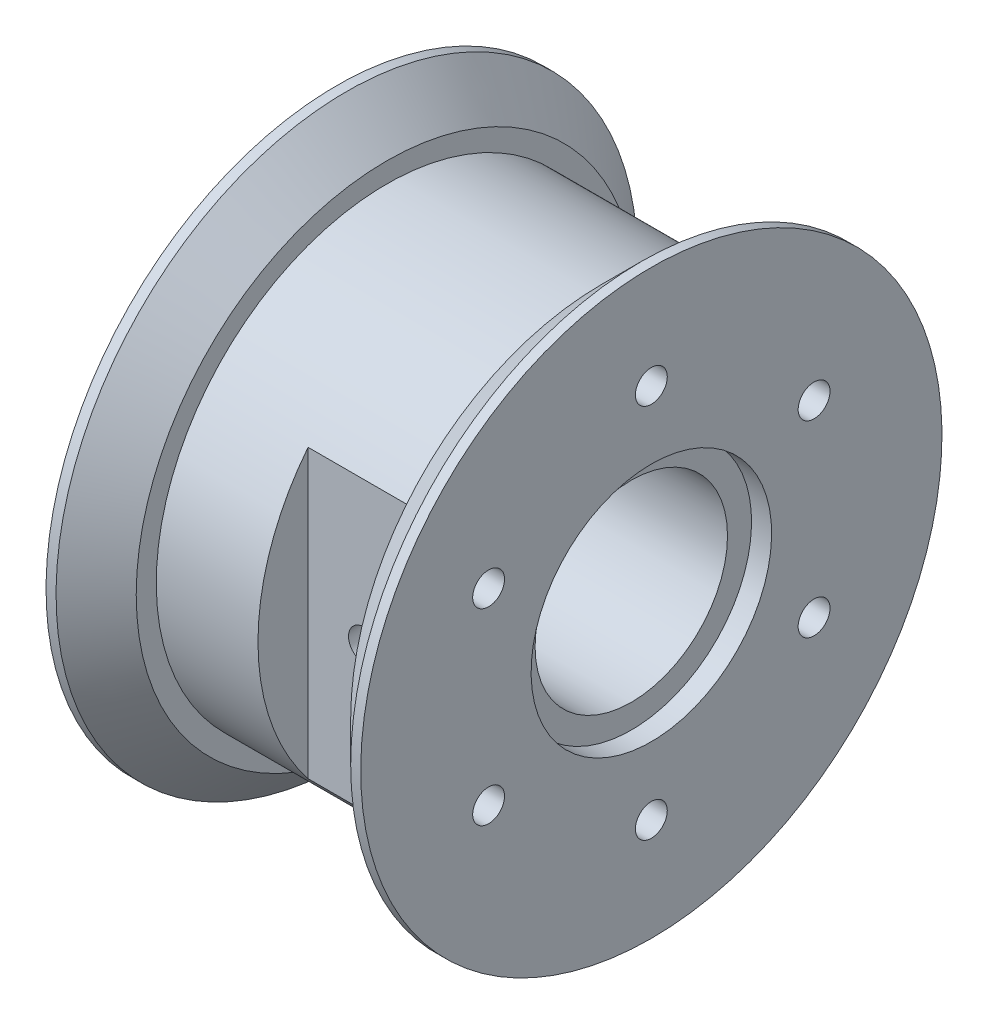
ISO-10303-21;
HEADER;
FILE_DESCRIPTION(('STEP AP214'),'2;1');
FILE_NAME('part.step','',(''),(''),'','','');
FILE_SCHEMA(('AUTOMOTIVE_DESIGN { 1 0 10303 214 1 1 1 1 }'));
ENDSEC;
DATA;
#1=APPLICATION_CONTEXT('core data for automotive mechanical design processes');
#2=APPLICATION_PROTOCOL_DEFINITION('international standard','automotive_design',2000,#1);
#3=PRODUCT_CONTEXT('',#1,'mechanical');
#4=PRODUCT('Part','Part','',(#3));
#5=PRODUCT_RELATED_PRODUCT_CATEGORY('part','',(#4));
#6=PRODUCT_DEFINITION_FORMATION('','',#4);
#7=PRODUCT_DEFINITION_CONTEXT('part definition',#1,'design');
#8=PRODUCT_DEFINITION('design','',#6,#7);
#9=PRODUCT_DEFINITION_SHAPE('','',#8);
#10=(LENGTH_UNIT() NAMED_UNIT(*) SI_UNIT(.MILLI.,.METRE.));
#11=(NAMED_UNIT(*) PLANE_ANGLE_UNIT() SI_UNIT($,.RADIAN.));
#12=(NAMED_UNIT(*) SI_UNIT($,.STERADIAN.) SOLID_ANGLE_UNIT());
#13=UNCERTAINTY_MEASURE_WITH_UNIT(LENGTH_MEASURE(1.E-05),#10,'distance_accuracy_value','');
#14=(GEOMETRIC_REPRESENTATION_CONTEXT(3) GLOBAL_UNCERTAINTY_ASSIGNED_CONTEXT((#13)) GLOBAL_UNIT_ASSIGNED_CONTEXT((#10,
#11,#12)) REPRESENTATION_CONTEXT('',''));
#15=CARTESIAN_POINT('',(0.,0.,0.));
#16=DIRECTION('',(0.,0.,1.));
#17=DIRECTION('',(1.,0.,0.));
#18=AXIS2_PLACEMENT_3D('',#15,#16,#17);
#19=CARTESIAN_POINT('',(-36.3274124635593,0.,0.));
#20=DIRECTION('',(-1.,0.,0.));
#21=DIRECTION('',(0.,-1.,0.));
#22=AXIS2_PLACEMENT_3D('',#19,#20,#21);
#23=CYLINDRICAL_SURFACE('',#22,12.192);
#24=CARTESIAN_POINT('',(8.46455,0.,12.192));
#25=CARTESIAN_POINT('',(8.46454547626082,0.112599132530574,12.1919980776572));
#26=CARTESIAN_POINT('',(8.45510014747119,0.225259970952188,12.1904238828446));
#27=CARTESIAN_POINT('',(8.41758370035342,0.447422565748295,12.1842956901865));
#28=CARTESIAN_POINT('',(8.38949538847018,0.556921308501902,12.1797389417244));
#29=CARTESIAN_POINT('',(8.31556373109427,0.769513272323641,12.1681568052288));
#30=CARTESIAN_POINT('',(8.26973483744079,0.872611628156852,12.1611334269929));
#31=CARTESIAN_POINT('',(8.16166060494161,1.06964206936563,12.1453905238226));
#32=CARTESIAN_POINT('',(8.09941716984547,1.16357521598749,12.1366711956143));
#33=CARTESIAN_POINT('',(7.95965521380004,1.34050942647915,12.1184110939319));
#34=CARTESIAN_POINT('',(7.88201200541279,1.42341135674959,12.1088639991116));
#35=CARTESIAN_POINT('',(7.71392288138163,1.57507359959739,12.0900728365799));
#36=CARTESIAN_POINT('',(7.62347616297226,1.64383302479224,12.0808287879138));
#37=CARTESIAN_POINT('',(7.43166747460659,1.76565496247473,12.0636291263491));
#38=CARTESIAN_POINT('',(7.33024253655695,1.81861958545782,12.0556816812748));
#39=CARTESIAN_POINT('',(7.11978188528665,1.90672248446984,12.0420626629305));
#40=CARTESIAN_POINT('',(7.01074668013711,1.94186194923652,12.0363909379009));
#41=CARTESIAN_POINT('',(6.78921089475453,1.99300500650413,12.0280283979426));
#42=CARTESIAN_POINT('',(6.67675082721022,2.00917965095774,12.0253109535699));
#43=CARTESIAN_POINT('',(6.45068258966002,2.02246424653786,12.0230840764303));
#44=CARTESIAN_POINT('',(6.33707450044971,2.01957553010477,12.023574419454));
#45=CARTESIAN_POINT('',(6.1131553677765,1.99495476140075,12.0276833994726));
#46=CARTESIAN_POINT('',(6.00282253797142,1.97341475484272,12.0312701527042));
#47=CARTESIAN_POINT('',(5.78735881022073,1.91240418388494,12.0411179132151));
#48=CARTESIAN_POINT('',(5.68222808879213,1.87293301151003,12.0473790111703));
#49=CARTESIAN_POINT('',(5.47957731491906,1.77698551398162,12.0619044849438));
#50=CARTESIAN_POINT('',(5.38209576864517,1.72042933683019,12.0701782313361));
#51=CARTESIAN_POINT('',(5.19793363572303,1.59197395791785,12.0877902349716));
#52=CARTESIAN_POINT('',(5.11125391107751,1.5200735329016,12.0971285770575));
#53=CARTESIAN_POINT('',(4.95004420232294,1.36192377808402,12.1159577209739));
#54=CARTESIAN_POINT('',(4.87567584460964,1.27550965365974,12.1254489902507));
#55=CARTESIAN_POINT('',(4.74247057364268,1.0913431081372,12.1434089146516));
#56=CARTESIAN_POINT('',(4.68363375816173,0.993590615668279,12.151877563338));
#57=CARTESIAN_POINT('',(4.58314744287834,0.789370974613244,12.1668498695204));
#58=CARTESIAN_POINT('',(4.54151210295493,0.682896732514396,12.1733519069703));
#59=CARTESIAN_POINT('',(4.4767599893017,0.46433514941073,12.1836453425467));
#60=CARTESIAN_POINT('',(4.45364168593997,0.352248272860227,12.1874369645691));
#61=CARTESIAN_POINT('',(4.42679872023212,0.127036348825992,12.191852278682));
#62=CARTESIAN_POINT('',(4.42285215656961,0.0139384353885066,12.1925122160526));
#63=CARTESIAN_POINT('',(4.43387327142103,-0.2113027236323,12.1906890368139));
#64=CARTESIAN_POINT('',(4.4488402315514,-0.323446005312082,12.1882060395812));
#65=CARTESIAN_POINT('',(4.49707897651445,-0.542910022803671,12.1803984251591));
#66=CARTESIAN_POINT('',(4.53024101679547,-0.650255539379789,12.175090850267));
#67=CARTESIAN_POINT('',(4.61381166427007,-0.857863304297609,12.1622268646506));
#68=CARTESIAN_POINT('',(4.66422122991712,-0.958125158623065,12.1546703289536));
#69=CARTESIAN_POINT('',(4.7813650183831,-1.14968416862138,12.1380569108324));
#70=CARTESIAN_POINT('',(4.84823799329552,-1.24089536593261,12.1289874992258));
#71=CARTESIAN_POINT('',(4.99621930193714,-1.41088022807608,12.1103924888405));
#72=CARTESIAN_POINT('',(5.0773286559859,-1.48965300067874,12.1008668574001));
#73=CARTESIAN_POINT('',(5.25247506900583,-1.63334649392562,12.0823159559837));
#74=CARTESIAN_POINT('',(5.34663581733579,-1.69811736408589,12.0732967971031));
#75=CARTESIAN_POINT('',(5.54463153320543,-1.8109222158311,12.0568937789947));
#76=CARTESIAN_POINT('',(5.64846619673977,-1.85895672313598,12.0495098684034));
#77=CARTESIAN_POINT('',(5.86244144672265,-1.93670067970794,12.0372591307288));
#78=CARTESIAN_POINT('',(5.97255421729947,-1.96648499543003,12.0323820335873));
#79=CARTESIAN_POINT('',(6.19630717081389,-2.00711886935702,12.0256712616742));
#80=CARTESIAN_POINT('',(6.30994705042768,-2.01797005120417,12.0238373259318));
#81=CARTESIAN_POINT('',(6.5360322192468,-2.02038478612102,12.0234316717887));
#82=CARTESIAN_POINT('',(6.64847498750257,-2.01218419450612,12.0248200617377));
#83=CARTESIAN_POINT('',(6.8703574011773,-1.97723786505857,12.0306152420894));
#84=CARTESIAN_POINT('',(6.97979705598131,-1.95049218518823,12.0350220230582));
#85=CARTESIAN_POINT('',(7.19247713110153,-1.87930479454748,12.0463423718281));
#86=CARTESIAN_POINT('',(7.29572442583575,-1.83488314137348,12.0532530975161));
#87=CARTESIAN_POINT('',(7.49333911004551,-1.72962895152308,12.0688054704218));
#88=CARTESIAN_POINT('',(7.58770606780559,-1.66879561755208,12.077447201728));
#89=CARTESIAN_POINT('',(7.76607339051496,-1.53160216838851,12.0956144651243));
#90=CARTESIAN_POINT('',(7.84993931913892,-1.45506846021787,12.1051491671409));
#91=CARTESIAN_POINT('',(8.00371907271968,-1.28901286236179,12.1239546893462));
#92=CARTESIAN_POINT('',(8.07362967214436,-1.19948797822991,12.1332254481054));
#93=CARTESIAN_POINT('',(8.19794886517251,-1.0092669925733,12.1505316291825));
#94=CARTESIAN_POINT('',(8.25224862342295,-0.908498952047676,12.158558206889));
#95=CARTESIAN_POINT('',(8.34306679384606,-0.699180345478856,12.1723855349459));
#96=CARTESIAN_POINT('',(8.37960296152261,-0.590637675585881,12.1781885066552));
#97=CARTESIAN_POINT('',(8.42590319700851,-0.401390762297659,12.1856446373988));
#98=CARTESIAN_POINT('',(8.44037260696804,-0.321832929924343,12.1880151921467));
#99=CARTESIAN_POINT('',(8.45969755002387,-0.161527304444679,12.1911935498128));
#100=CARTESIAN_POINT('',(8.4645532453672,-0.0807795314436797,12.1920013791043));
#101=CARTESIAN_POINT('',(8.46455,0.,12.192));
#102=B_SPLINE_CURVE_WITH_KNOTS('',3,(#24,#25,#26,#27,#28,#29,#30,#31,#32,#33,#34,#35,#36,#37,
#38,#39,#40,#41,#42,#43,#44,#45,#46,#47,#48,#49,#50,#51,#52,#53,#54,#55,#56,#57,#58,#59,#60,#61,
#62,#63,#64,#65,#66,#67,#68,#69,#70,#71,#72,#73,#74,#75,#76,#77,#78,#79,#80,#81,#82,#83,#84,#85,
#86,#87,#88,#89,#90,#91,#92,#93,#94,#95,#96,#97,#98,#99,#100,#101),.UNSPECIFIED.,.T.,.F.,(4,2,2,
2,2,2,2,2,2,2,2,2,2,2,2,2,2,2,2,2,2,2,2,2,2,2,2,2,2,2,2,2,2,2,2,2,2,2,4),(0.,0.337502131114422,
0.675315958032755,1.0128551720785,1.35035525571366,1.69070857473007,2.03108324297054,
2.37352554629562,2.71594500956391,3.05525168773673,3.3945346501996,3.7303651267103,
4.06620699075852,4.40364345926132,4.74110683851655,5.08269905335348,5.42429341849819,
5.76616841907571,6.10801517556281,6.44589567796441,6.78376334719417,7.11961520201245,
7.45548572331559,7.79429012743225,8.13311882354164,8.47541155025958,8.81769352396406,
9.15856181039929,9.49940086367336,9.83604295262694,10.1726839894168,10.5089441112776,
10.8452205719079,11.1854375981689,11.5257331688713,11.8683466593587,12.2106169846594,
12.4527478388091,12.6948746065732),.UNSPECIFIED.);
#103=CARTESIAN_POINT('',(8.46455,0.,12.192));
#104=VERTEX_POINT('',#103);
#105=EDGE_CURVE('E122',#104,#104,#102,.T.);
#106=ORIENTED_EDGE('',*,*,#105,.T.);
#107=EDGE_LOOP('',(#106));
#108=FACE_BOUND('',#107,.T.);
#109=CARTESIAN_POINT('',(17.399,0.,0.));
#110=DIRECTION('',(1.,0.,0.));
#111=DIRECTION('',(0.,1.,0.));
#112=AXIS2_PLACEMENT_3D('',#109,#110,#111);
#113=CIRCLE('',#112,12.192);
#114=CARTESIAN_POINT('',(17.399,12.192,0.));
#115=VERTEX_POINT('',#114);
#116=EDGE_CURVE('E293',#115,#115,#113,.F.);
#117=ORIENTED_EDGE('',*,*,#116,.F.);
#118=EDGE_LOOP('',(#117));
#119=FACE_BOUND('',#118,.T.);
#120=CARTESIAN_POINT('',(-17.399,0.,0.));
#121=DIRECTION('',(-1.,0.,0.));
#122=DIRECTION('',(0.,-1.,0.));
#123=AXIS2_PLACEMENT_3D('',#120,#121,#122);
#124=CIRCLE('',#123,12.192);
#125=CARTESIAN_POINT('',(-17.399,-12.192,0.));
#126=VERTEX_POINT('',#125);
#127=EDGE_CURVE('E296',#126,#126,#124,.F.);
#128=ORIENTED_EDGE('',*,*,#127,.F.);
#129=EDGE_LOOP('',(#128));
#130=FACE_BOUND('',#129,.T.);
#131=ADVANCED_FACE('F37',(#108,#119,#130),#23,.F.);
#132=CARTESIAN_POINT('',(-19.939,36.83,0.));
#133=DIRECTION('',(1.,0.,0.));
#134=DIRECTION('',(0.,1.,0.));
#135=AXIS2_PLACEMENT_3D('',#132,#133,#134);
#136=PLANE('',#135);
#137=CARTESIAN_POINT('',(-19.939,-11.9062500000002,-20.6222299276168));
#138=DIRECTION('',(-1.,0.,0.));
#139=DIRECTION('',(0.,0.,1.));
#140=AXIS2_PLACEMENT_3D('',#137,#138,#139);
#141=CIRCLE('',#140,2.01929999999999);
#142=CARTESIAN_POINT('',(-19.939,-11.9062500000002,-18.6029299276168));
#143=VERTEX_POINT('',#142);
#144=EDGE_CURVE('E109',#143,#143,#141,.T.);
#145=ORIENTED_EDGE('',*,*,#144,.F.);
#146=EDGE_LOOP('',(#145));
#147=FACE_BOUND('',#146,.T.);
#148=CARTESIAN_POINT('',(-19.939,11.9062499999998,-20.6222299276171));
#149=DIRECTION('',(-1.,0.,0.));
#150=DIRECTION('',(0.,0.,1.));
#151=AXIS2_PLACEMENT_3D('',#148,#149,#150);
#152=CIRCLE('',#151,2.01929999999999);
#153=CARTESIAN_POINT('',(-19.939,11.9062499999998,-18.6029299276171));
#154=VERTEX_POINT('',#153);
#155=EDGE_CURVE('E388',#154,#154,#152,.T.);
#156=ORIENTED_EDGE('',*,*,#155,.F.);
#157=EDGE_LOOP('',(#156));
#158=FACE_BOUND('',#157,.T.);
#159=CARTESIAN_POINT('',(-19.939,23.8125,0.));
#160=DIRECTION('',(-1.,0.,0.));
#161=DIRECTION('',(0.,0.,1.));
#162=AXIS2_PLACEMENT_3D('',#159,#160,#161);
#163=CIRCLE('',#162,2.01929999999999);
#164=CARTESIAN_POINT('',(-19.939,23.8125,2.01929999999999));
#165=VERTEX_POINT('',#164);
#166=EDGE_CURVE('E382',#165,#165,#163,.T.);
#167=ORIENTED_EDGE('',*,*,#166,.F.);
#168=EDGE_LOOP('',(#167));
#169=FACE_BOUND('',#168,.T.);
#170=CARTESIAN_POINT('',(-19.939,11.9062500000001,20.6222299276169));
#171=DIRECTION('',(-1.,0.,0.));
#172=DIRECTION('',(0.,0.,1.));
#173=AXIS2_PLACEMENT_3D('',#170,#171,#172);
#174=CIRCLE('',#173,2.01929999999999);
#175=CARTESIAN_POINT('',(-19.939,11.9062500000001,22.6415299276169));
#176=VERTEX_POINT('',#175);
#177=EDGE_CURVE('E376',#176,#176,#174,.T.);
#178=ORIENTED_EDGE('',*,*,#177,.F.);
#179=EDGE_LOOP('',(#178));
#180=FACE_BOUND('',#179,.T.);
#181=CARTESIAN_POINT('',(-19.939,-11.9062499999999,20.622229927617));
#182=DIRECTION('',(-1.,0.,0.));
#183=DIRECTION('',(0.,0.,1.));
#184=AXIS2_PLACEMENT_3D('',#181,#182,#183);
#185=CIRCLE('',#184,2.01929999999999);
#186=CARTESIAN_POINT('',(-19.939,-11.9062499999999,22.641529927617));
#187=VERTEX_POINT('',#186);
#188=EDGE_CURVE('E370',#187,#187,#185,.T.);
#189=ORIENTED_EDGE('',*,*,#188,.F.);
#190=EDGE_LOOP('',(#189));
#191=FACE_BOUND('',#190,.T.);
#192=CARTESIAN_POINT('',(-19.939,-23.8125,0.));
#193=DIRECTION('',(-1.,0.,0.));
#194=DIRECTION('',(0.,0.,1.));
#195=AXIS2_PLACEMENT_3D('',#192,#193,#194);
#196=CIRCLE('',#195,2.01929999999999);
#197=CARTESIAN_POINT('',(-19.939,-23.8125,2.01929999999999));
#198=VERTEX_POINT('',#197);
#199=EDGE_CURVE('E364',#198,#198,#196,.T.);
#200=ORIENTED_EDGE('',*,*,#199,.F.);
#201=EDGE_LOOP('',(#200));
#202=FACE_BOUND('',#201,.T.);
#203=CARTESIAN_POINT('',(-19.939,0.,0.));
#204=DIRECTION('',(1.,0.,0.));
#205=DIRECTION('',(0.,1.,0.));
#206=AXIS2_PLACEMENT_3D('',#203,#204,#205);
#207=CIRCLE('',#206,15.24);
#208=CARTESIAN_POINT('',(-19.939,15.24,0.));
#209=VERTEX_POINT('',#208);
#210=EDGE_CURVE('E305',#209,#209,#207,.T.);
#211=ORIENTED_EDGE('',*,*,#210,.T.);
#212=EDGE_LOOP('',(#211));
#213=FACE_BOUND('',#212,.T.);
#214=CARTESIAN_POINT('',(-19.939,0.,0.));
#215=DIRECTION('',(-1.,0.,0.));
#216=DIRECTION('',(0.,-1.,0.));
#217=AXIS2_PLACEMENT_3D('',#214,#215,#216);
#218=CIRCLE('',#217,36.83);
#219=CARTESIAN_POINT('',(-19.939,-36.83,0.));
#220=VERTEX_POINT('',#219);
#221=EDGE_CURVE('E318',#220,#220,#218,.T.);
#222=ORIENTED_EDGE('',*,*,#221,.T.);
#223=EDGE_LOOP('',(#222));
#224=FACE_BOUND('',#223,.T.);
#225=ADVANCED_FACE('F275',(#147,#158,#169,#180,#191,#202,#213,#224),#136,.F.);
#226=CARTESIAN_POINT('',(19.939,12.192,0.));
#227=DIRECTION('',(-1.,0.,0.));
#228=DIRECTION('',(0.,-1.,0.));
#229=AXIS2_PLACEMENT_3D('',#226,#227,#228);
#230=PLANE('',#229);
#231=CARTESIAN_POINT('',(19.939,-11.9062500000002,-20.6222299276168));
#232=DIRECTION('',(1.,0.,0.));
#233=DIRECTION('',(0.,0.,-1.));
#234=AXIS2_PLACEMENT_3D('',#231,#232,#233);
#235=CIRCLE('',#234,2.01929999999999);
#236=CARTESIAN_POINT('',(19.939,-11.9062500000002,-22.6415299276168));
#237=VERTEX_POINT('',#236);
#238=EDGE_CURVE('E358',#237,#237,#235,.T.);
#239=ORIENTED_EDGE('',*,*,#238,.F.);
#240=EDGE_LOOP('',(#239));
#241=FACE_BOUND('',#240,.T.);
#242=CARTESIAN_POINT('',(19.939,11.9062499999998,-20.6222299276171));
#243=DIRECTION('',(1.,0.,0.));
#244=DIRECTION('',(0.,0.,-1.));
#245=AXIS2_PLACEMENT_3D('',#242,#243,#244);
#246=CIRCLE('',#245,2.01929999999999);
#247=CARTESIAN_POINT('',(19.939,11.9062499999998,-22.641529927617));
#248=VERTEX_POINT('',#247);
#249=EDGE_CURVE('E352',#248,#248,#246,.T.);
#250=ORIENTED_EDGE('',*,*,#249,.F.);
#251=EDGE_LOOP('',(#250));
#252=FACE_BOUND('',#251,.T.);
#253=CARTESIAN_POINT('',(19.939,23.8125,0.));
#254=DIRECTION('',(1.,0.,0.));
#255=DIRECTION('',(0.,0.,-1.));
#256=AXIS2_PLACEMENT_3D('',#253,#254,#255);
#257=CIRCLE('',#256,2.01929999999999);
#258=CARTESIAN_POINT('',(19.939,23.8125,-2.01929999999999));
#259=VERTEX_POINT('',#258);
#260=EDGE_CURVE('E346',#259,#259,#257,.T.);
#261=ORIENTED_EDGE('',*,*,#260,.F.);
#262=EDGE_LOOP('',(#261));
#263=FACE_BOUND('',#262,.T.);
#264=CARTESIAN_POINT('',(19.939,11.9062500000001,20.6222299276169));
#265=DIRECTION('',(1.,0.,0.));
#266=DIRECTION('',(0.,0.,-1.));
#267=AXIS2_PLACEMENT_3D('',#264,#265,#266);
#268=CIRCLE('',#267,2.01929999999999);
#269=CARTESIAN_POINT('',(19.939,11.9062500000001,18.6029299276169));
#270=VERTEX_POINT('',#269);
#271=EDGE_CURVE('E340',#270,#270,#268,.T.);
#272=ORIENTED_EDGE('',*,*,#271,.F.);
#273=EDGE_LOOP('',(#272));
#274=FACE_BOUND('',#273,.T.);
#275=CARTESIAN_POINT('',(19.939,-11.9062499999999,20.622229927617));
#276=DIRECTION('',(1.,0.,0.));
#277=DIRECTION('',(0.,0.,-1.));
#278=AXIS2_PLACEMENT_3D('',#275,#276,#277);
#279=CIRCLE('',#278,2.01929999999999);
#280=CARTESIAN_POINT('',(19.939,-11.9062499999999,18.602929927617));
#281=VERTEX_POINT('',#280);
#282=EDGE_CURVE('E334',#281,#281,#279,.T.);
#283=ORIENTED_EDGE('',*,*,#282,.F.);
#284=EDGE_LOOP('',(#283));
#285=FACE_BOUND('',#284,.T.);
#286=CARTESIAN_POINT('',(19.939,-23.8125,0.));
#287=DIRECTION('',(1.,0.,0.));
#288=DIRECTION('',(0.,0.,-1.));
#289=AXIS2_PLACEMENT_3D('',#286,#287,#288);
#290=CIRCLE('',#289,2.01929999999999);
#291=CARTESIAN_POINT('',(19.939,-23.8125,-2.01929999999999));
#292=VERTEX_POINT('',#291);
#293=EDGE_CURVE('E328',#292,#292,#290,.T.);
#294=ORIENTED_EDGE('',*,*,#293,.F.);
#295=EDGE_LOOP('',(#294));
#296=FACE_BOUND('',#295,.T.);
#297=CARTESIAN_POINT('',(19.939,0.,0.));
#298=DIRECTION('',(1.,0.,0.));
#299=DIRECTION('',(0.,1.,0.));
#300=AXIS2_PLACEMENT_3D('',#297,#298,#299);
#301=CIRCLE('',#300,15.24);
#302=CARTESIAN_POINT('',(19.939,15.24,0.));
#303=VERTEX_POINT('',#302);
#304=EDGE_CURVE('E298',#303,#303,#301,.T.);
#305=ORIENTED_EDGE('',*,*,#304,.F.);
#306=EDGE_LOOP('',(#305));
#307=FACE_BOUND('',#306,.T.);
#308=CARTESIAN_POINT('',(19.939,0.,0.));
#309=DIRECTION('',(-1.,0.,0.));
#310=DIRECTION('',(0.,-1.,0.));
#311=AXIS2_PLACEMENT_3D('',#308,#309,#310);
#312=CIRCLE('',#311,36.83);
#313=CARTESIAN_POINT('',(19.939,-36.83,0.));
#314=VERTEX_POINT('',#313);
#315=EDGE_CURVE('E309',#314,#314,#312,.T.);
#316=ORIENTED_EDGE('',*,*,#315,.F.);
#317=EDGE_LOOP('',(#316));
#318=FACE_BOUND('',#317,.T.);
#319=ADVANCED_FACE('F272',(#241,#252,#263,#274,#285,#296,#307,#318),#230,.F.);
#320=CARTESIAN_POINT('',(-36.3274124635593,0.,0.));
#321=DIRECTION('',(-1.,0.,0.));
#322=DIRECTION('',(0.,-1.,0.));
#323=AXIS2_PLACEMENT_3D('',#320,#321,#322);
#324=CYLINDRICAL_SURFACE('',#323,36.83);
#325=CARTESIAN_POINT('',(18.669,0.,0.));
#326=DIRECTION('',(1.,0.,0.));
#327=DIRECTION('',(0.,1.,0.));
#328=AXIS2_PLACEMENT_3D('',#325,#326,#327);
#329=CIRCLE('',#328,36.83);
#330=CARTESIAN_POINT('',(18.669,36.83,0.));
#331=VERTEX_POINT('',#330);
#332=EDGE_CURVE('E118',#331,#331,#329,.T.);
#333=ORIENTED_EDGE('',*,*,#332,.T.);
#334=EDGE_LOOP('',(#333));
#335=FACE_BOUND('',#334,.T.);
#336=ORIENTED_EDGE('',*,*,#315,.T.);
#337=EDGE_LOOP('',(#336));
#338=FACE_BOUND('',#337,.T.);
#339=ADVANCED_FACE('F269',(#335,#338),#324,.T.);
#340=CARTESIAN_POINT('',(13.589,36.83,0.));
#341=DIRECTION('',(1.,0.,0.));
#342=DIRECTION('',(0.,1.,0.));
#343=AXIS2_PLACEMENT_3D('',#340,#341,#342);
#344=PLANE('',#343);
#345=CARTESIAN_POINT('',(13.589,0.,0.));
#346=DIRECTION('',(1.,0.,0.));
#347=DIRECTION('',(0.,1.,0.));
#348=AXIS2_PLACEMENT_3D('',#345,#346,#347);
#349=CIRCLE('',#348,31.75);
#350=CARTESIAN_POINT('',(13.589,31.75,0.));
#351=VERTEX_POINT('',#350);
#352=EDGE_CURVE('E115',#351,#351,#349,.F.);
#353=ORIENTED_EDGE('',*,*,#352,.T.);
#354=EDGE_LOOP('',(#353));
#355=FACE_BOUND('',#354,.T.);
#356=DIRECTION('',(0.,1.,0.));
#357=VECTOR('',#356,1.);
#358=CARTESIAN_POINT('',(13.589,-36.83,22.86));
#359=LINE('',#358,#357);
#360=CARTESIAN_POINT('',(13.589,-18.1836327503609,22.86));
#361=VERTEX_POINT('',#360);
#362=CARTESIAN_POINT('',(13.589,18.183632750361,22.86));
#363=VERTEX_POINT('',#362);
#364=EDGE_CURVE('E52',#361,#363,#359,.T.);
#365=ORIENTED_EDGE('',*,*,#364,.F.);
#366=CARTESIAN_POINT('',(13.589,0.,0.));
#367=DIRECTION('',(-1.,0.,0.));
#368=DIRECTION('',(0.,-1.,0.));
#369=AXIS2_PLACEMENT_3D('',#366,#367,#368);
#370=CIRCLE('',#369,29.21);
#371=EDGE_CURVE('E114',#363,#361,#370,.T.);
#372=ORIENTED_EDGE('',*,*,#371,.F.);
#373=EDGE_LOOP('',(#365,#372));
#374=FACE_BOUND('',#373,.T.);
#375=ADVANCED_FACE('F265',(#355,#374),#344,.F.);
#376=CARTESIAN_POINT('',(-36.3274124635593,0.,0.));
#377=DIRECTION('',(-1.,0.,0.));
#378=DIRECTION('',(0.,-1.,0.));
#379=AXIS2_PLACEMENT_3D('',#376,#377,#378);
#380=CYLINDRICAL_SURFACE('',#379,29.21);
#381=CARTESIAN_POINT('',(-13.589,0.,0.));
#382=DIRECTION('',(-1.,0.,0.));
#383=DIRECTION('',(0.,-1.,0.));
#384=AXIS2_PLACEMENT_3D('',#381,#382,#383);
#385=CIRCLE('',#384,29.21);
#386=CARTESIAN_POINT('',(-13.589,-29.21,0.));
#387=VERTEX_POINT('',#386);
#388=EDGE_CURVE('E313',#387,#387,#385,.T.);
#389=ORIENTED_EDGE('',*,*,#388,.F.);
#390=EDGE_LOOP('',(#389));
#391=FACE_BOUND('',#390,.T.);
#392=DIRECTION('',(-1.,0.,0.));
#393=VECTOR('',#392,1.);
#394=CARTESIAN_POINT('',(-36.3274124635593,-18.183632750361,22.86));
#395=LINE('',#394,#393);
#396=CARTESIAN_POINT('',(-0.698499999999998,-18.1836327503609,22.86));
#397=VERTEX_POINT('',#396);
#398=EDGE_CURVE('E105',#361,#397,#395,.T.);
#399=ORIENTED_EDGE('',*,*,#398,.T.);
#400=CARTESIAN_POINT('',(-0.698499999999998,0.,0.));
#401=DIRECTION('',(-1.,0.,0.));
#402=DIRECTION('',(0.,0.,1.));
#403=AXIS2_PLACEMENT_3D('',#400,#401,#402);
#404=CIRCLE('',#403,29.21);
#405=CARTESIAN_POINT('',(-0.698499999999998,18.183632750361,22.86));
#406=VERTEX_POINT('',#405);
#407=EDGE_CURVE('E99',#397,#406,#404,.T.);
#408=ORIENTED_EDGE('',*,*,#407,.T.);
#409=DIRECTION('',(-1.,0.,0.));
#410=VECTOR('',#409,1.);
#411=CARTESIAN_POINT('',(-36.3274124635593,18.183632750361,22.86));
#412=LINE('',#411,#410);
#413=EDGE_CURVE('E106',#406,#363,#412,.F.);
#414=ORIENTED_EDGE('',*,*,#413,.T.);
#415=ORIENTED_EDGE('',*,*,#371,.T.);
#416=EDGE_LOOP('',(#399,#408,#414,#415));
#417=FACE_BOUND('',#416,.T.);
#418=ADVANCED_FACE('F112',(#391,#417),#380,.T.);
#419=CARTESIAN_POINT('',(-13.589,29.21,0.));
#420=DIRECTION('',(-1.,0.,0.));
#421=DIRECTION('',(0.,-1.,0.));
#422=AXIS2_PLACEMENT_3D('',#419,#420,#421);
#423=PLANE('',#422);
#424=CARTESIAN_POINT('',(-13.589,0.,0.));
#425=DIRECTION('',(-1.,0.,0.));
#426=DIRECTION('',(0.,-1.,0.));
#427=AXIS2_PLACEMENT_3D('',#424,#425,#426);
#428=CIRCLE('',#427,31.75);
#429=CARTESIAN_POINT('',(-13.589,-31.75,0.));
#430=VERTEX_POINT('',#429);
#431=EDGE_CURVE('E11',#430,#430,#428,.F.);
#432=ORIENTED_EDGE('',*,*,#431,.T.);
#433=EDGE_LOOP('',(#432));
#434=FACE_BOUND('',#433,.T.);
#435=ORIENTED_EDGE('',*,*,#388,.T.);
#436=EDGE_LOOP('',(#435));
#437=FACE_BOUND('',#436,.T.);
#438=ADVANCED_FACE('F258',(#434,#437),#423,.F.);
#439=CARTESIAN_POINT('',(-36.3274124635593,0.,0.));
#440=DIRECTION('',(-1.,0.,0.));
#441=DIRECTION('',(0.,-1.,0.));
#442=AXIS2_PLACEMENT_3D('',#439,#440,#441);
#443=CYLINDRICAL_SURFACE('',#442,36.83);
#444=CARTESIAN_POINT('',(-18.669,0.,0.));
#445=DIRECTION('',(-1.,0.,0.));
#446=DIRECTION('',(0.,-1.,0.));
#447=AXIS2_PLACEMENT_3D('',#444,#445,#446);
#448=CIRCLE('',#447,36.83);
#449=CARTESIAN_POINT('',(-18.669,-36.83,0.));
#450=VERTEX_POINT('',#449);
#451=EDGE_CURVE('E45',#450,#450,#448,.T.);
#452=ORIENTED_EDGE('',*,*,#451,.T.);
#453=EDGE_LOOP('',(#452));
#454=FACE_BOUND('',#453,.T.);
#455=ORIENTED_EDGE('',*,*,#221,.F.);
#456=EDGE_LOOP('',(#455));
#457=FACE_BOUND('',#456,.T.);
#458=ADVANCED_FACE('F251',(#454,#457),#443,.T.);
#459=CARTESIAN_POINT('',(17.399,0.,0.));
#460=DIRECTION('',(1.,0.,0.));
#461=DIRECTION('',(0.,1.,0.));
#462=AXIS2_PLACEMENT_3D('',#459,#460,#461);
#463=PLANE('',#462);
#464=CARTESIAN_POINT('',(17.399,0.,0.));
#465=DIRECTION('',(1.,0.,0.));
#466=DIRECTION('',(0.,1.,0.));
#467=AXIS2_PLACEMENT_3D('',#464,#465,#466);
#468=CIRCLE('',#467,15.24);
#469=CARTESIAN_POINT('',(17.399,15.24,0.));
#470=VERTEX_POINT('',#469);
#471=EDGE_CURVE('E302',#470,#470,#468,.T.);
#472=ORIENTED_EDGE('',*,*,#471,.T.);
#473=EDGE_LOOP('',(#472));
#474=FACE_BOUND('',#473,.T.);
#475=ORIENTED_EDGE('',*,*,#116,.T.);
#476=EDGE_LOOP('',(#475));
#477=FACE_BOUND('',#476,.T.);
#478=ADVANCED_FACE('F248',(#474,#477),#463,.T.);
#479=CARTESIAN_POINT('',(17.399,0.,0.));
#480=DIRECTION('',(1.,0.,0.));
#481=DIRECTION('',(0.,1.,0.));
#482=AXIS2_PLACEMENT_3D('',#479,#480,#481);
#483=CYLINDRICAL_SURFACE('',#482,15.24);
#484=ORIENTED_EDGE('',*,*,#471,.F.);
#485=EDGE_LOOP('',(#484));
#486=FACE_BOUND('',#485,.T.);
#487=ORIENTED_EDGE('',*,*,#304,.T.);
#488=EDGE_LOOP('',(#487));
#489=FACE_BOUND('',#488,.T.);
#490=ADVANCED_FACE('F243',(#486,#489),#483,.F.);
#491=CARTESIAN_POINT('',(-17.399,0.,0.));
#492=DIRECTION('',(-1.,0.,0.));
#493=DIRECTION('',(0.,1.,0.));
#494=AXIS2_PLACEMENT_3D('',#491,#492,#493);
#495=PLANE('',#494);
#496=CARTESIAN_POINT('',(-17.399,0.,0.));
#497=DIRECTION('',(1.,0.,0.));
#498=DIRECTION('',(0.,1.,0.));
#499=AXIS2_PLACEMENT_3D('',#496,#497,#498);
#500=CIRCLE('',#499,15.24);
#501=CARTESIAN_POINT('',(-17.399,15.24,0.));
#502=VERTEX_POINT('',#501);
#503=EDGE_CURVE('E299',#502,#502,#500,.T.);
#504=ORIENTED_EDGE('',*,*,#503,.F.);
#505=EDGE_LOOP('',(#504));
#506=FACE_BOUND('',#505,.T.);
#507=ORIENTED_EDGE('',*,*,#127,.T.);
#508=EDGE_LOOP('',(#507));
#509=FACE_BOUND('',#508,.T.);
#510=ADVANCED_FACE('F240',(#506,#509),#495,.T.);
#511=CARTESIAN_POINT('',(-17.399,0.,0.));
#512=DIRECTION('',(-1.,0.,0.));
#513=DIRECTION('',(0.,-1.,0.));
#514=AXIS2_PLACEMENT_3D('',#511,#512,#513);
#515=CYLINDRICAL_SURFACE('',#514,15.24);
#516=ORIENTED_EDGE('',*,*,#503,.T.);
#517=EDGE_LOOP('',(#516));
#518=FACE_BOUND('',#517,.T.);
#519=ORIENTED_EDGE('',*,*,#210,.F.);
#520=EDGE_LOOP('',(#519));
#521=FACE_BOUND('',#520,.T.);
#522=ADVANCED_FACE('F239',(#518,#521),#515,.F.);
#523=CARTESIAN_POINT('',(8.001,-23.8125,0.));
#524=DIRECTION('',(1.,0.,0.));
#525=DIRECTION('',(0.,0.,-1.));
#526=AXIS2_PLACEMENT_3D('',#523,#524,#525);
#527=CONICAL_SURFACE('',#526,2.01929999999999,1.02974425867665);
#528=CARTESIAN_POINT('',(6.78768215199766,-23.8125,0.));
#529=VERTEX_POINT('',#528);
#530=VERTEX_LOOP('',#529);
#531=FACE_BOUND('',#530,.T.);
#532=CARTESIAN_POINT('',(8.001,-23.8125,0.));
#533=DIRECTION('',(1.,0.,0.));
#534=DIRECTION('',(0.,0.,-1.));
#535=AXIS2_PLACEMENT_3D('',#532,#533,#534);
#536=CIRCLE('',#535,2.01929999999999);
#537=CARTESIAN_POINT('',(8.001,-23.8125,-2.01929999999999));
#538=VERTEX_POINT('',#537);
#539=EDGE_CURVE('E324',#538,#538,#536,.T.);
#540=ORIENTED_EDGE('',*,*,#539,.T.);
#541=EDGE_LOOP('',(#540));
#542=FACE_BOUND('',#541,.T.);
#543=ADVANCED_FACE('F235',(#531,#542),#527,.F.);
#544=CARTESIAN_POINT('',(19.939,-23.8125,0.));
#545=DIRECTION('',(1.,0.,0.));
#546=DIRECTION('',(0.,0.,-1.));
#547=AXIS2_PLACEMENT_3D('',#544,#545,#546);
#548=CYLINDRICAL_SURFACE('',#547,2.01929999999999);
#549=ORIENTED_EDGE('',*,*,#539,.F.);
#550=EDGE_LOOP('',(#549));
#551=FACE_BOUND('',#550,.T.);
#552=ORIENTED_EDGE('',*,*,#293,.T.);
#553=EDGE_LOOP('',(#552));
#554=FACE_BOUND('',#553,.T.);
#555=ADVANCED_FACE('F231',(#551,#554),#548,.F.);
#556=CARTESIAN_POINT('',(8.001,-11.9062499999999,20.622229927617));
#557=DIRECTION('',(1.,0.,0.));
#558=DIRECTION('',(0.,0.,-1.));
#559=AXIS2_PLACEMENT_3D('',#556,#557,#558);
#560=CONICAL_SURFACE('',#559,2.01929999999999,1.02974425867665);
#561=CARTESIAN_POINT('',(6.78768215199765,-11.90625,20.622229927617));
#562=VERTEX_POINT('',#561);
#563=VERTEX_LOOP('',#562);
#564=FACE_BOUND('',#563,.T.);
#565=CARTESIAN_POINT('',(8.001,-11.9062499999999,20.622229927617));
#566=DIRECTION('',(1.,0.,0.));
#567=DIRECTION('',(0.,0.,-1.));
#568=AXIS2_PLACEMENT_3D('',#565,#566,#567);
#569=CIRCLE('',#568,2.01929999999999);
#570=CARTESIAN_POINT('',(8.001,-11.9062499999999,18.602929927617));
#571=VERTEX_POINT('',#570);
#572=EDGE_CURVE('E331',#571,#571,#569,.T.);
#573=ORIENTED_EDGE('',*,*,#572,.T.);
#574=EDGE_LOOP('',(#573));
#575=FACE_BOUND('',#574,.T.);
#576=ADVANCED_FACE('F227',(#564,#575),#560,.F.);
#577=CARTESIAN_POINT('',(19.939,-11.9062499999999,20.622229927617));
#578=DIRECTION('',(1.,0.,0.));
#579=DIRECTION('',(0.,0.,-1.));
#580=AXIS2_PLACEMENT_3D('',#577,#578,#579);
#581=CYLINDRICAL_SURFACE('',#580,2.01929999999999);
#582=ORIENTED_EDGE('',*,*,#572,.F.);
#583=EDGE_LOOP('',(#582));
#584=FACE_BOUND('',#583,.T.);
#585=ORIENTED_EDGE('',*,*,#282,.T.);
#586=EDGE_LOOP('',(#585));
#587=FACE_BOUND('',#586,.T.);
#588=ADVANCED_FACE('F223',(#584,#587),#581,.F.);
#589=CARTESIAN_POINT('',(8.001,11.9062500000001,20.6222299276169));
#590=DIRECTION('',(1.,0.,0.));
#591=DIRECTION('',(0.,0.,-1.));
#592=AXIS2_PLACEMENT_3D('',#589,#590,#591);
#593=CONICAL_SURFACE('',#592,2.01929999999999,1.02974425867665);
#594=CARTESIAN_POINT('',(6.78768215199765,11.9062500000001,20.6222299276169));
#595=VERTEX_POINT('',#594);
#596=VERTEX_LOOP('',#595);
#597=FACE_BOUND('',#596,.T.);
#598=CARTESIAN_POINT('',(8.001,11.9062500000001,20.6222299276169));
#599=DIRECTION('',(1.,0.,0.));
#600=DIRECTION('',(0.,0.,-1.));
#601=AXIS2_PLACEMENT_3D('',#598,#599,#600);
#602=CIRCLE('',#601,2.01929999999999);
#603=CARTESIAN_POINT('',(8.001,11.9062500000001,18.6029299276169));
#604=VERTEX_POINT('',#603);
#605=EDGE_CURVE('E337',#604,#604,#602,.T.);
#606=ORIENTED_EDGE('',*,*,#605,.T.);
#607=EDGE_LOOP('',(#606));
#608=FACE_BOUND('',#607,.T.);
#609=ADVANCED_FACE('F219',(#597,#608),#593,.F.);
#610=CARTESIAN_POINT('',(19.939,11.9062500000001,20.6222299276169));
#611=DIRECTION('',(1.,0.,0.));
#612=DIRECTION('',(0.,0.,-1.));
#613=AXIS2_PLACEMENT_3D('',#610,#611,#612);
#614=CYLINDRICAL_SURFACE('',#613,2.01929999999999);
#615=ORIENTED_EDGE('',*,*,#605,.F.);
#616=EDGE_LOOP('',(#615));
#617=FACE_BOUND('',#616,.T.);
#618=ORIENTED_EDGE('',*,*,#271,.T.);
#619=EDGE_LOOP('',(#618));
#620=FACE_BOUND('',#619,.T.);
#621=ADVANCED_FACE('F215',(#617,#620),#614,.F.);
#622=CARTESIAN_POINT('',(8.00099999999999,23.8125,0.));
#623=DIRECTION('',(1.,0.,0.));
#624=DIRECTION('',(0.,0.,-1.));
#625=AXIS2_PLACEMENT_3D('',#622,#623,#624);
#626=CONICAL_SURFACE('',#625,2.01929999999999,1.02974425867665);
#627=CARTESIAN_POINT('',(6.78768215199765,23.8125,0.));
#628=VERTEX_POINT('',#627);
#629=VERTEX_LOOP('',#628);
#630=FACE_BOUND('',#629,.T.);
#631=CARTESIAN_POINT('',(8.00099999999999,23.8125,0.));
#632=DIRECTION('',(1.,0.,0.));
#633=DIRECTION('',(0.,0.,-1.));
#634=AXIS2_PLACEMENT_3D('',#631,#632,#633);
#635=CIRCLE('',#634,2.01929999999999);
#636=CARTESIAN_POINT('',(8.00099999999999,23.8125,-2.01929999999999));
#637=VERTEX_POINT('',#636);
#638=EDGE_CURVE('E343',#637,#637,#635,.T.);
#639=ORIENTED_EDGE('',*,*,#638,.T.);
#640=EDGE_LOOP('',(#639));
#641=FACE_BOUND('',#640,.T.);
#642=ADVANCED_FACE('F211',(#630,#641),#626,.F.);
#643=CARTESIAN_POINT('',(19.939,23.8125,0.));
#644=DIRECTION('',(1.,0.,0.));
#645=DIRECTION('',(0.,0.,-1.));
#646=AXIS2_PLACEMENT_3D('',#643,#644,#645);
#647=CYLINDRICAL_SURFACE('',#646,2.01929999999999);
#648=ORIENTED_EDGE('',*,*,#638,.F.);
#649=EDGE_LOOP('',(#648));
#650=FACE_BOUND('',#649,.T.);
#651=ORIENTED_EDGE('',*,*,#260,.T.);
#652=EDGE_LOOP('',(#651));
#653=FACE_BOUND('',#652,.T.);
#654=ADVANCED_FACE('F207',(#650,#653),#647,.F.);
#655=CARTESIAN_POINT('',(8.001,11.9062499999998,-20.6222299276171));
#656=DIRECTION('',(1.,0.,0.));
#657=DIRECTION('',(0.,0.,-1.));
#658=AXIS2_PLACEMENT_3D('',#655,#656,#657);
#659=CONICAL_SURFACE('',#658,2.01929999999999,1.02974425867665);
#660=CARTESIAN_POINT('',(6.78768215199765,11.9062499999998,-20.6222299276171));
#661=VERTEX_POINT('',#660);
#662=VERTEX_LOOP('',#661);
#663=FACE_BOUND('',#662,.T.);
#664=CARTESIAN_POINT('',(8.001,11.9062499999998,-20.6222299276171));
#665=DIRECTION('',(1.,0.,0.));
#666=DIRECTION('',(0.,0.,-1.));
#667=AXIS2_PLACEMENT_3D('',#664,#665,#666);
#668=CIRCLE('',#667,2.01929999999999);
#669=CARTESIAN_POINT('',(8.001,11.9062499999998,-22.641529927617));
#670=VERTEX_POINT('',#669);
#671=EDGE_CURVE('E349',#670,#670,#668,.T.);
#672=ORIENTED_EDGE('',*,*,#671,.T.);
#673=EDGE_LOOP('',(#672));
#674=FACE_BOUND('',#673,.T.);
#675=ADVANCED_FACE('F203',(#663,#674),#659,.F.);
#676=CARTESIAN_POINT('',(19.939,11.9062499999998,-20.6222299276171));
#677=DIRECTION('',(1.,0.,0.));
#678=DIRECTION('',(0.,0.,-1.));
#679=AXIS2_PLACEMENT_3D('',#676,#677,#678);
#680=CYLINDRICAL_SURFACE('',#679,2.01929999999999);
#681=ORIENTED_EDGE('',*,*,#671,.F.);
#682=EDGE_LOOP('',(#681));
#683=FACE_BOUND('',#682,.T.);
#684=ORIENTED_EDGE('',*,*,#249,.T.);
#685=EDGE_LOOP('',(#684));
#686=FACE_BOUND('',#685,.T.);
#687=ADVANCED_FACE('F199',(#683,#686),#680,.F.);
#688=CARTESIAN_POINT('',(8.001,-11.9062500000002,-20.6222299276168));
#689=DIRECTION('',(1.,0.,0.));
#690=DIRECTION('',(0.,0.,-1.));
#691=AXIS2_PLACEMENT_3D('',#688,#689,#690);
#692=CONICAL_SURFACE('',#691,2.01929999999999,1.02974425867665);
#693=CARTESIAN_POINT('',(6.78768215199765,-11.9062500000002,-20.6222299276168));
#694=VERTEX_POINT('',#693);
#695=VERTEX_LOOP('',#694);
#696=FACE_BOUND('',#695,.T.);
#697=CARTESIAN_POINT('',(8.001,-11.9062500000002,-20.6222299276168));
#698=DIRECTION('',(1.,0.,0.));
#699=DIRECTION('',(0.,0.,-1.));
#700=AXIS2_PLACEMENT_3D('',#697,#698,#699);
#701=CIRCLE('',#700,2.01929999999999);
#702=CARTESIAN_POINT('',(8.001,-11.9062500000002,-22.6415299276168));
#703=VERTEX_POINT('',#702);
#704=EDGE_CURVE('E355',#703,#703,#701,.T.);
#705=ORIENTED_EDGE('',*,*,#704,.T.);
#706=EDGE_LOOP('',(#705));
#707=FACE_BOUND('',#706,.T.);
#708=ADVANCED_FACE('F195',(#696,#707),#692,.F.);
#709=CARTESIAN_POINT('',(19.939,-11.9062500000002,-20.6222299276168));
#710=DIRECTION('',(1.,0.,0.));
#711=DIRECTION('',(0.,0.,-1.));
#712=AXIS2_PLACEMENT_3D('',#709,#710,#711);
#713=CYLINDRICAL_SURFACE('',#712,2.01929999999999);
#714=ORIENTED_EDGE('',*,*,#704,.F.);
#715=EDGE_LOOP('',(#714));
#716=FACE_BOUND('',#715,.T.);
#717=ORIENTED_EDGE('',*,*,#238,.T.);
#718=EDGE_LOOP('',(#717));
#719=FACE_BOUND('',#718,.T.);
#720=ADVANCED_FACE('F191',(#716,#719),#713,.F.);
#721=CARTESIAN_POINT('',(-8.001,-23.8125,0.));
#722=DIRECTION('',(-1.,0.,0.));
#723=DIRECTION('',(0.,0.,1.));
#724=AXIS2_PLACEMENT_3D('',#721,#722,#723);
#725=CONICAL_SURFACE('',#724,2.01929999999999,1.02974425867665);
#726=CARTESIAN_POINT('',(-6.78768215199766,-23.8125,0.));
#727=VERTEX_POINT('',#726);
#728=VERTEX_LOOP('',#727);
#729=FACE_BOUND('',#728,.T.);
#730=CARTESIAN_POINT('',(-8.001,-23.8125,0.));
#731=DIRECTION('',(-1.,0.,0.));
#732=DIRECTION('',(0.,0.,1.));
#733=AXIS2_PLACEMENT_3D('',#730,#731,#732);
#734=CIRCLE('',#733,2.01929999999999);
#735=CARTESIAN_POINT('',(-8.001,-23.8125,2.01929999999999));
#736=VERTEX_POINT('',#735);
#737=EDGE_CURVE('E361',#736,#736,#734,.T.);
#738=ORIENTED_EDGE('',*,*,#737,.T.);
#739=EDGE_LOOP('',(#738));
#740=FACE_BOUND('',#739,.T.);
#741=ADVANCED_FACE('F187',(#729,#740),#725,.F.);
#742=CARTESIAN_POINT('',(-19.939,-23.8125,0.));
#743=DIRECTION('',(-1.,0.,0.));
#744=DIRECTION('',(0.,0.,1.));
#745=AXIS2_PLACEMENT_3D('',#742,#743,#744);
#746=CYLINDRICAL_SURFACE('',#745,2.01929999999999);
#747=ORIENTED_EDGE('',*,*,#737,.F.);
#748=EDGE_LOOP('',(#747));
#749=FACE_BOUND('',#748,.T.);
#750=ORIENTED_EDGE('',*,*,#199,.T.);
#751=EDGE_LOOP('',(#750));
#752=FACE_BOUND('',#751,.T.);
#753=ADVANCED_FACE('F183',(#749,#752),#746,.F.);
#754=CARTESIAN_POINT('',(-8.001,-11.9062499999999,20.622229927617));
#755=DIRECTION('',(-1.,0.,0.));
#756=DIRECTION('',(0.,0.,1.));
#757=AXIS2_PLACEMENT_3D('',#754,#755,#756);
#758=CONICAL_SURFACE('',#757,2.01929999999999,1.02974425867665);
#759=CARTESIAN_POINT('',(-6.78768215199765,-11.90625,20.622229927617));
#760=VERTEX_POINT('',#759);
#761=VERTEX_LOOP('',#760);
#762=FACE_BOUND('',#761,.T.);
#763=CARTESIAN_POINT('',(-8.001,-11.9062499999999,20.622229927617));
#764=DIRECTION('',(-1.,0.,0.));
#765=DIRECTION('',(0.,0.,1.));
#766=AXIS2_PLACEMENT_3D('',#763,#764,#765);
#767=CIRCLE('',#766,2.01929999999999);
#768=CARTESIAN_POINT('',(-8.001,-11.9062499999999,22.641529927617));
#769=VERTEX_POINT('',#768);
#770=EDGE_CURVE('E367',#769,#769,#767,.T.);
#771=ORIENTED_EDGE('',*,*,#770,.T.);
#772=EDGE_LOOP('',(#771));
#773=FACE_BOUND('',#772,.T.);
#774=ADVANCED_FACE('F179',(#762,#773),#758,.F.);
#775=CARTESIAN_POINT('',(-19.939,-11.9062499999999,20.622229927617));
#776=DIRECTION('',(-1.,0.,0.));
#777=DIRECTION('',(0.,0.,1.));
#778=AXIS2_PLACEMENT_3D('',#775,#776,#777);
#779=CYLINDRICAL_SURFACE('',#778,2.01929999999999);
#780=ORIENTED_EDGE('',*,*,#770,.F.);
#781=EDGE_LOOP('',(#780));
#782=FACE_BOUND('',#781,.T.);
#783=ORIENTED_EDGE('',*,*,#188,.T.);
#784=EDGE_LOOP('',(#783));
#785=FACE_BOUND('',#784,.T.);
#786=ADVANCED_FACE('F175',(#782,#785),#779,.F.);
#787=CARTESIAN_POINT('',(-8.001,11.9062500000001,20.6222299276169));
#788=DIRECTION('',(-1.,0.,0.));
#789=DIRECTION('',(0.,0.,1.));
#790=AXIS2_PLACEMENT_3D('',#787,#788,#789);
#791=CONICAL_SURFACE('',#790,2.01929999999999,1.02974425867665);
#792=CARTESIAN_POINT('',(-6.78768215199765,11.9062500000001,20.6222299276169));
#793=VERTEX_POINT('',#792);
#794=VERTEX_LOOP('',#793);
#795=FACE_BOUND('',#794,.T.);
#796=CARTESIAN_POINT('',(-8.001,11.9062500000001,20.6222299276169));
#797=DIRECTION('',(-1.,0.,0.));
#798=DIRECTION('',(0.,0.,1.));
#799=AXIS2_PLACEMENT_3D('',#796,#797,#798);
#800=CIRCLE('',#799,2.01929999999999);
#801=CARTESIAN_POINT('',(-8.001,11.9062500000001,22.6415299276169));
#802=VERTEX_POINT('',#801);
#803=EDGE_CURVE('E373',#802,#802,#800,.T.);
#804=ORIENTED_EDGE('',*,*,#803,.T.);
#805=EDGE_LOOP('',(#804));
#806=FACE_BOUND('',#805,.T.);
#807=ADVANCED_FACE('F171',(#795,#806),#791,.F.);
#808=CARTESIAN_POINT('',(-19.939,11.9062500000001,20.6222299276169));
#809=DIRECTION('',(-1.,0.,0.));
#810=DIRECTION('',(0.,0.,1.));
#811=AXIS2_PLACEMENT_3D('',#808,#809,#810);
#812=CYLINDRICAL_SURFACE('',#811,2.01929999999999);
#813=ORIENTED_EDGE('',*,*,#803,.F.);
#814=EDGE_LOOP('',(#813));
#815=FACE_BOUND('',#814,.T.);
#816=ORIENTED_EDGE('',*,*,#177,.T.);
#817=EDGE_LOOP('',(#816));
#818=FACE_BOUND('',#817,.T.);
#819=ADVANCED_FACE('F167',(#815,#818),#812,.F.);
#820=CARTESIAN_POINT('',(-8.00099999999999,23.8125,0.));
#821=DIRECTION('',(-1.,0.,0.));
#822=DIRECTION('',(0.,0.,1.));
#823=AXIS2_PLACEMENT_3D('',#820,#821,#822);
#824=CONICAL_SURFACE('',#823,2.01929999999999,1.02974425867665);
#825=CARTESIAN_POINT('',(-6.78768215199765,23.8125,0.));
#826=VERTEX_POINT('',#825);
#827=VERTEX_LOOP('',#826);
#828=FACE_BOUND('',#827,.T.);
#829=CARTESIAN_POINT('',(-8.00099999999999,23.8125,0.));
#830=DIRECTION('',(-1.,0.,0.));
#831=DIRECTION('',(0.,0.,1.));
#832=AXIS2_PLACEMENT_3D('',#829,#830,#831);
#833=CIRCLE('',#832,2.01929999999999);
#834=CARTESIAN_POINT('',(-8.00099999999999,23.8125,2.01929999999999));
#835=VERTEX_POINT('',#834);
#836=EDGE_CURVE('E379',#835,#835,#833,.T.);
#837=ORIENTED_EDGE('',*,*,#836,.T.);
#838=EDGE_LOOP('',(#837));
#839=FACE_BOUND('',#838,.T.);
#840=ADVANCED_FACE('F163',(#828,#839),#824,.F.);
#841=CARTESIAN_POINT('',(-19.939,23.8125,0.));
#842=DIRECTION('',(-1.,0.,0.));
#843=DIRECTION('',(0.,0.,1.));
#844=AXIS2_PLACEMENT_3D('',#841,#842,#843);
#845=CYLINDRICAL_SURFACE('',#844,2.01929999999999);
#846=ORIENTED_EDGE('',*,*,#836,.F.);
#847=EDGE_LOOP('',(#846));
#848=FACE_BOUND('',#847,.T.);
#849=ORIENTED_EDGE('',*,*,#166,.T.);
#850=EDGE_LOOP('',(#849));
#851=FACE_BOUND('',#850,.T.);
#852=ADVANCED_FACE('F159',(#848,#851),#845,.F.);
#853=CARTESIAN_POINT('',(-8.001,11.9062499999998,-20.6222299276171));
#854=DIRECTION('',(-1.,0.,0.));
#855=DIRECTION('',(0.,0.,1.));
#856=AXIS2_PLACEMENT_3D('',#853,#854,#855);
#857=CONICAL_SURFACE('',#856,2.01929999999999,1.02974425867665);
#858=CARTESIAN_POINT('',(-6.78768215199765,11.9062499999998,-20.6222299276171));
#859=VERTEX_POINT('',#858);
#860=VERTEX_LOOP('',#859);
#861=FACE_BOUND('',#860,.T.);
#862=CARTESIAN_POINT('',(-8.001,11.9062499999998,-20.6222299276171));
#863=DIRECTION('',(-1.,0.,0.));
#864=DIRECTION('',(0.,0.,1.));
#865=AXIS2_PLACEMENT_3D('',#862,#863,#864);
#866=CIRCLE('',#865,2.01929999999999);
#867=CARTESIAN_POINT('',(-8.001,11.9062499999998,-18.6029299276171));
#868=VERTEX_POINT('',#867);
#869=EDGE_CURVE('E385',#868,#868,#866,.T.);
#870=ORIENTED_EDGE('',*,*,#869,.T.);
#871=EDGE_LOOP('',(#870));
#872=FACE_BOUND('',#871,.T.);
#873=ADVANCED_FACE('F155',(#861,#872),#857,.F.);
#874=CARTESIAN_POINT('',(-19.939,11.9062499999998,-20.6222299276171));
#875=DIRECTION('',(-1.,0.,0.));
#876=DIRECTION('',(0.,0.,1.));
#877=AXIS2_PLACEMENT_3D('',#874,#875,#876);
#878=CYLINDRICAL_SURFACE('',#877,2.01929999999999);
#879=ORIENTED_EDGE('',*,*,#869,.F.);
#880=EDGE_LOOP('',(#879));
#881=FACE_BOUND('',#880,.T.);
#882=ORIENTED_EDGE('',*,*,#155,.T.);
#883=EDGE_LOOP('',(#882));
#884=FACE_BOUND('',#883,.T.);
#885=ADVANCED_FACE('F151',(#881,#884),#878,.F.);
#886=CARTESIAN_POINT('',(-8.001,-11.9062500000002,-20.6222299276168));
#887=DIRECTION('',(-1.,0.,0.));
#888=DIRECTION('',(0.,0.,1.));
#889=AXIS2_PLACEMENT_3D('',#886,#887,#888);
#890=CONICAL_SURFACE('',#889,2.01929999999999,1.02974425867665);
#891=CARTESIAN_POINT('',(-6.78768215199765,-11.9062500000002,-20.6222299276168));
#892=VERTEX_POINT('',#891);
#893=VERTEX_LOOP('',#892);
#894=FACE_BOUND('',#893,.T.);
#895=CARTESIAN_POINT('',(-8.001,-11.9062500000002,-20.6222299276168));
#896=DIRECTION('',(-1.,0.,0.));
#897=DIRECTION('',(0.,0.,1.));
#898=AXIS2_PLACEMENT_3D('',#895,#896,#897);
#899=CIRCLE('',#898,2.01929999999999);
#900=CARTESIAN_POINT('',(-8.001,-11.9062500000002,-18.6029299276168));
#901=VERTEX_POINT('',#900);
#902=EDGE_CURVE('E391',#901,#901,#899,.T.);
#903=ORIENTED_EDGE('',*,*,#902,.T.);
#904=EDGE_LOOP('',(#903));
#905=FACE_BOUND('',#904,.T.);
#906=ADVANCED_FACE('F147',(#894,#905),#890,.F.);
#907=CARTESIAN_POINT('',(-19.939,-11.9062500000002,-20.6222299276168));
#908=DIRECTION('',(-1.,0.,0.));
#909=DIRECTION('',(0.,0.,1.));
#910=AXIS2_PLACEMENT_3D('',#907,#908,#909);
#911=CYLINDRICAL_SURFACE('',#910,2.01929999999999);
#912=ORIENTED_EDGE('',*,*,#902,.F.);
#913=EDGE_LOOP('',(#912));
#914=FACE_BOUND('',#913,.T.);
#915=ORIENTED_EDGE('',*,*,#144,.T.);
#916=EDGE_LOOP('',(#915));
#917=FACE_BOUND('',#916,.T.);
#918=ADVANCED_FACE('F141',(#914,#917),#911,.F.);
#919=CARTESIAN_POINT('',(-0.698499999999998,-36.83,29.21));
#920=DIRECTION('',(-1.,0.,0.));
#921=DIRECTION('',(0.,0.,1.));
#922=AXIS2_PLACEMENT_3D('',#919,#920,#921);
#923=PLANE('',#922);
#924=ORIENTED_EDGE('',*,*,#407,.F.);
#925=DIRECTION('',(0.,1.,0.));
#926=VECTOR('',#925,1.);
#927=CARTESIAN_POINT('',(-0.698499999999998,-36.83,22.86));
#928=LINE('',#927,#926);
#929=EDGE_CURVE('E102',#397,#406,#928,.T.);
#930=ORIENTED_EDGE('',*,*,#929,.T.);
#931=EDGE_LOOP('',(#924,#930));
#932=FACE_BOUND('',#931,.T.);
#933=ADVANCED_FACE('F101',(#932),#923,.F.);
#934=CARTESIAN_POINT('',(13.589,-36.83,22.86));
#935=DIRECTION('',(0.,0.,-1.));
#936=DIRECTION('',(-1.,0.,0.));
#937=AXIS2_PLACEMENT_3D('',#934,#935,#936);
#938=PLANE('',#937);
#939=CARTESIAN_POINT('',(6.44525,0.,22.86));
#940=DIRECTION('',(0.,0.,1.));
#941=DIRECTION('',(1.,0.,0.));
#942=AXIS2_PLACEMENT_3D('',#939,#940,#941);
#943=CIRCLE('',#942,2.0193);
#944=CARTESIAN_POINT('',(8.46455,0.,22.86));
#945=VERTEX_POINT('',#944);
#946=EDGE_CURVE('E128',#945,#945,#943,.T.);
#947=ORIENTED_EDGE('',*,*,#946,.F.);
#948=EDGE_LOOP('',(#947));
#949=FACE_BOUND('',#948,.T.);
#950=ORIENTED_EDGE('',*,*,#364,.T.);
#951=ORIENTED_EDGE('',*,*,#413,.F.);
#952=ORIENTED_EDGE('',*,*,#929,.F.);
#953=ORIENTED_EDGE('',*,*,#398,.F.);
#954=EDGE_LOOP('',(#950,#951,#952,#953));
#955=FACE_BOUND('',#954,.T.);
#956=ADVANCED_FACE('F108',(#949,#955),#938,.F.);
#957=CARTESIAN_POINT('',(6.44525,0.,22.86));
#958=DIRECTION('',(0.,0.,1.));
#959=DIRECTION('',(1.,0.,0.));
#960=AXIS2_PLACEMENT_3D('',#957,#958,#959);
#961=CYLINDRICAL_SURFACE('',#960,2.0193);
#962=ORIENTED_EDGE('',*,*,#946,.T.);
#963=EDGE_LOOP('',(#962));
#964=FACE_BOUND('',#963,.T.);
#965=ORIENTED_EDGE('',*,*,#105,.F.);
#966=EDGE_LOOP('',(#965));
#967=FACE_BOUND('',#966,.T.);
#968=ADVANCED_FACE('F133',(#964,#967),#961,.F.);
#969=CARTESIAN_POINT('',(13.589,0.,0.));
#970=DIRECTION('',(1.,0.,0.));
#971=DIRECTION('',(0.,1.,0.));
#972=AXIS2_PLACEMENT_3D('',#969,#970,#971);
#973=CONICAL_SURFACE('',#972,31.75,0.785398163397446);
#974=ORIENTED_EDGE('',*,*,#332,.F.);
#975=EDGE_LOOP('',(#974));
#976=FACE_BOUND('',#975,.T.);
#977=ORIENTED_EDGE('',*,*,#352,.F.);
#978=EDGE_LOOP('',(#977));
#979=FACE_BOUND('',#978,.T.);
#980=ADVANCED_FACE('F137',(#976,#979),#973,.T.);
#981=CARTESIAN_POINT('',(-18.669,0.,0.));
#982=DIRECTION('',(-1.,0.,0.));
#983=DIRECTION('',(0.,-1.,0.));
#984=AXIS2_PLACEMENT_3D('',#981,#982,#983);
#985=CONICAL_SURFACE('',#984,36.83,0.78539816339745);
#986=ORIENTED_EDGE('',*,*,#431,.F.);
#987=EDGE_LOOP('',(#986));
#988=FACE_BOUND('',#987,.T.);
#989=ORIENTED_EDGE('',*,*,#451,.F.);
#990=EDGE_LOOP('',(#989));
#991=FACE_BOUND('',#990,.T.);
#992=ADVANCED_FACE('F39',(#988,#991),#985,.T.);
#993=CLOSED_SHELL('',(#131,#225,#319,#339,#375,#418,#438,#458,#478,#490,#510,#522,#543,#555,
#576,#588,#609,#621,#642,#654,#675,#687,#708,#720,#741,#753,#774,#786,#807,#819,#840,#852,#873,
#885,#906,#918,#933,#956,#968,#980,#992));
#994=MANIFOLD_SOLID_BREP('B2',#993);
#995=ADVANCED_BREP_SHAPE_REPRESENTATION('',(#18,#994),#14);
#996=SHAPE_DEFINITION_REPRESENTATION(#9,#995);
ENDSEC;
END-ISO-10303-21;
